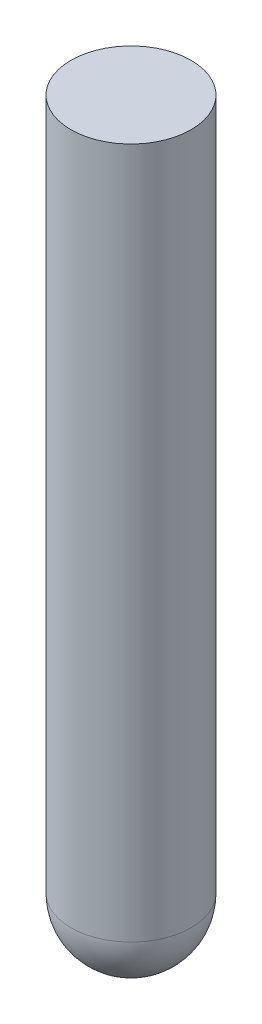
ISO-10303-21;
HEADER;
FILE_DESCRIPTION(('STEP AP214'),'2;1');
FILE_NAME('part.step','',(''),(''),'','','');
FILE_SCHEMA(('AUTOMOTIVE_DESIGN { 1 0 10303 214 1 1 1 1 }'));
ENDSEC;
DATA;
#1=APPLICATION_CONTEXT('core data for automotive mechanical design processes');
#2=APPLICATION_PROTOCOL_DEFINITION('international standard','automotive_design',2000,#1);
#3=PRODUCT_CONTEXT('',#1,'mechanical');
#4=PRODUCT('Part','Part','',(#3));
#5=PRODUCT_RELATED_PRODUCT_CATEGORY('part','',(#4));
#6=PRODUCT_DEFINITION_FORMATION('','',#4);
#7=PRODUCT_DEFINITION_CONTEXT('part definition',#1,'design');
#8=PRODUCT_DEFINITION('design','',#6,#7);
#9=PRODUCT_DEFINITION_SHAPE('','',#8);
#10=(LENGTH_UNIT() NAMED_UNIT(*) SI_UNIT(.MILLI.,.METRE.));
#11=(NAMED_UNIT(*) PLANE_ANGLE_UNIT() SI_UNIT($,.RADIAN.));
#12=(NAMED_UNIT(*) SI_UNIT($,.STERADIAN.) SOLID_ANGLE_UNIT());
#13=UNCERTAINTY_MEASURE_WITH_UNIT(LENGTH_MEASURE(1.E-05),#10,'distance_accuracy_value','');
#14=(GEOMETRIC_REPRESENTATION_CONTEXT(3) GLOBAL_UNCERTAINTY_ASSIGNED_CONTEXT((#13)) GLOBAL_UNIT_ASSIGNED_CONTEXT((#10,
#11,#12)) REPRESENTATION_CONTEXT('',''));
#15=CARTESIAN_POINT('',(0.,0.,0.));
#16=DIRECTION('',(0.,0.,1.));
#17=DIRECTION('',(1.,0.,0.));
#18=AXIS2_PLACEMENT_3D('',#15,#16,#17);
#19=CARTESIAN_POINT('',(0.,50.,0.));
#20=DIRECTION('',(0.,-1.,0.));
#21=DIRECTION('',(0.,0.,-1.));
#22=AXIS2_PLACEMENT_3D('',#19,#20,#21);
#23=CYLINDRICAL_SURFACE('',#22,4.);
#24=CARTESIAN_POINT('',(0.,4.,0.));
#25=DIRECTION('',(0.,-1.,0.));
#26=DIRECTION('',(0.,0.,-1.));
#27=AXIS2_PLACEMENT_3D('',#24,#25,#26);
#28=CIRCLE('',#27,4.);
#29=CARTESIAN_POINT('',(0.,4.,-4.));
#30=VERTEX_POINT('',#29);
#31=EDGE_CURVE('E10',#30,#30,#28,.F.);
#32=ORIENTED_EDGE('',*,*,#31,.T.);
#33=EDGE_LOOP('',(#32));
#34=FACE_BOUND('',#33,.T.);
#35=CARTESIAN_POINT('',(0.,50.,0.));
#36=DIRECTION('',(0.,1.,0.));
#37=DIRECTION('',(0.,0.,1.));
#38=AXIS2_PLACEMENT_3D('',#35,#36,#37);
#39=CIRCLE('',#38,4.);
#40=CARTESIAN_POINT('',(0.,50.,4.));
#41=VERTEX_POINT('',#40);
#42=EDGE_CURVE('E38',#41,#41,#39,.T.);
#43=ORIENTED_EDGE('',*,*,#42,.F.);
#44=EDGE_LOOP('',(#43));
#45=FACE_BOUND('',#44,.T.);
#46=ADVANCED_FACE('F31',(#34,#45),#23,.T.);
#47=CARTESIAN_POINT('',(0.,50.,0.));
#48=DIRECTION('',(0.,1.,0.));
#49=DIRECTION('',(0.,0.,1.));
#50=AXIS2_PLACEMENT_3D('',#47,#48,#49);
#51=PLANE('',#50);
#52=ORIENTED_EDGE('',*,*,#42,.T.);
#53=EDGE_LOOP('',(#52));
#54=FACE_BOUND('',#53,.T.);
#55=ADVANCED_FACE('F44',(#54),#51,.T.);
#56=CARTESIAN_POINT('',(0.,4.,0.));
#57=DIRECTION('',(0.,1.,0.));
#58=DIRECTION('',(0.,0.,1.));
#59=AXIS2_PLACEMENT_3D('',#56,#57,#58);
#60=SPHERICAL_SURFACE('',#59,4.);
#61=ORIENTED_EDGE('',*,*,#31,.F.);
#62=EDGE_LOOP('',(#61));
#63=FACE_BOUND('',#62,.T.);
#64=ADVANCED_FACE('F33',(#63),#60,.T.);
#65=CLOSED_SHELL('',(#46,#55,#64));
#66=MANIFOLD_SOLID_BREP('B2',#65);
#67=ADVANCED_BREP_SHAPE_REPRESENTATION('',(#18,#66),#14);
#68=SHAPE_DEFINITION_REPRESENTATION(#9,#67);
ENDSEC;
END-ISO-10303-21;
